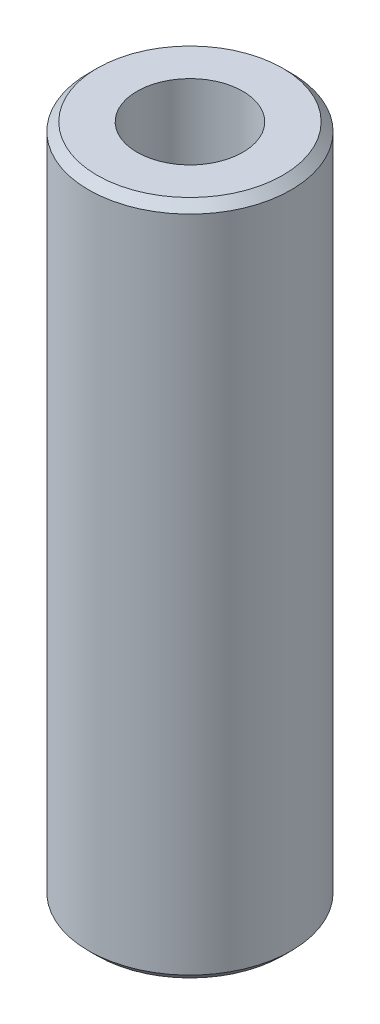
ISO-10303-21;
HEADER;
FILE_DESCRIPTION(('STEP AP214'),'2;1');
FILE_NAME('part.step','',(''),(''),'','','');
FILE_SCHEMA(('AUTOMOTIVE_DESIGN { 1 0 10303 214 1 1 1 1 }'));
ENDSEC;
DATA;
#1=APPLICATION_CONTEXT('core data for automotive mechanical design processes');
#2=APPLICATION_PROTOCOL_DEFINITION('international standard','automotive_design',2000,#1);
#3=PRODUCT_CONTEXT('',#1,'mechanical');
#4=PRODUCT('Part','Part','',(#3));
#5=PRODUCT_RELATED_PRODUCT_CATEGORY('part','',(#4));
#6=PRODUCT_DEFINITION_FORMATION('','',#4);
#7=PRODUCT_DEFINITION_CONTEXT('part definition',#1,'design');
#8=PRODUCT_DEFINITION('design','',#6,#7);
#9=PRODUCT_DEFINITION_SHAPE('','',#8);
#10=(LENGTH_UNIT() NAMED_UNIT(*) SI_UNIT(.MILLI.,.METRE.));
#11=(NAMED_UNIT(*) PLANE_ANGLE_UNIT() SI_UNIT($,.RADIAN.));
#12=(NAMED_UNIT(*) SI_UNIT($,.STERADIAN.) SOLID_ANGLE_UNIT());
#13=UNCERTAINTY_MEASURE_WITH_UNIT(LENGTH_MEASURE(1.E-05),#10,'distance_accuracy_value','');
#14=(GEOMETRIC_REPRESENTATION_CONTEXT(3) GLOBAL_UNCERTAINTY_ASSIGNED_CONTEXT((#13)) GLOBAL_UNIT_ASSIGNED_CONTEXT((#10,
#11,#12)) REPRESENTATION_CONTEXT('',''));
#15=CARTESIAN_POINT('',(0.,0.,0.));
#16=DIRECTION('',(0.,0.,1.));
#17=DIRECTION('',(1.,0.,0.));
#18=AXIS2_PLACEMENT_3D('',#15,#16,#17);
#19=CARTESIAN_POINT('',(0.,15.89999995,0.));
#20=DIRECTION('',(0.,-1.,0.));
#21=DIRECTION('',(0.,0.,-1.));
#22=AXIS2_PLACEMENT_3D('',#19,#20,#21);
#23=CYLINDRICAL_SURFACE('',#22,4.7625);
#24=CARTESIAN_POINT('',(0.,-15.50312495,0.));
#25=DIRECTION('',(0.,1.,0.));
#26=DIRECTION('',(0.,0.,1.));
#27=AXIS2_PLACEMENT_3D('',#24,#25,#26);
#28=CIRCLE('',#27,4.7625);
#29=CARTESIAN_POINT('',(0.,-15.50312495,4.7625));
#30=VERTEX_POINT('',#29);
#31=EDGE_CURVE('E45',#30,#30,#28,.T.);
#32=ORIENTED_EDGE('',*,*,#31,.T.);
#33=EDGE_LOOP('',(#32));
#34=FACE_BOUND('',#33,.T.);
#35=CARTESIAN_POINT('',(0.,15.50312495,0.));
#36=DIRECTION('',(0.,1.,0.));
#37=DIRECTION('',(0.,0.,1.));
#38=AXIS2_PLACEMENT_3D('',#35,#36,#37);
#39=CIRCLE('',#38,4.7625);
#40=CARTESIAN_POINT('',(0.,15.50312495,4.7625));
#41=VERTEX_POINT('',#40);
#42=EDGE_CURVE('E49',#41,#41,#39,.F.);
#43=ORIENTED_EDGE('',*,*,#42,.T.);
#44=EDGE_LOOP('',(#43));
#45=FACE_BOUND('',#44,.T.);
#46=ADVANCED_FACE('F33',(#34,#45),#23,.T.);
#47=CARTESIAN_POINT('',(0.,15.89999995,0.));
#48=DIRECTION('',(0.,1.,0.));
#49=DIRECTION('',(0.,0.,1.));
#50=AXIS2_PLACEMENT_3D('',#47,#48,#49);
#51=PLANE('',#50);
#52=CARTESIAN_POINT('',(0.,15.89999995,0.));
#53=DIRECTION('',(0.,1.,0.));
#54=DIRECTION('',(0.,0.,1.));
#55=AXIS2_PLACEMENT_3D('',#52,#53,#54);
#56=CIRCLE('',#55,2.4892);
#57=CARTESIAN_POINT('',(0.,15.89999995,2.4892));
#58=VERTEX_POINT('',#57);
#59=EDGE_CURVE('E57',#58,#58,#56,.T.);
#60=ORIENTED_EDGE('',*,*,#59,.F.);
#61=EDGE_LOOP('',(#60));
#62=FACE_BOUND('',#61,.T.);
#63=CARTESIAN_POINT('',(0.,15.89999995,0.));
#64=DIRECTION('',(0.,1.,0.));
#65=DIRECTION('',(0.,0.,1.));
#66=AXIS2_PLACEMENT_3D('',#63,#64,#65);
#67=CIRCLE('',#66,4.365625);
#68=CARTESIAN_POINT('',(0.,15.89999995,4.365625));
#69=VERTEX_POINT('',#68);
#70=EDGE_CURVE('E10',#69,#69,#67,.T.);
#71=ORIENTED_EDGE('',*,*,#70,.T.);
#72=EDGE_LOOP('',(#71));
#73=FACE_BOUND('',#72,.T.);
#74=ADVANCED_FACE('F63',(#62,#73),#51,.T.);
#75=CARTESIAN_POINT('',(0.,-15.89999995,0.));
#76=DIRECTION('',(0.,1.,0.));
#77=DIRECTION('',(0.,0.,1.));
#78=AXIS2_PLACEMENT_3D('',#75,#76,#77);
#79=PLANE('',#78);
#80=CARTESIAN_POINT('',(0.,-15.89999995,0.));
#81=DIRECTION('',(0.,1.,0.));
#82=DIRECTION('',(0.,0.,1.));
#83=AXIS2_PLACEMENT_3D('',#80,#81,#82);
#84=CIRCLE('',#83,2.4892);
#85=CARTESIAN_POINT('',(0.,-15.89999995,2.4892));
#86=VERTEX_POINT('',#85);
#87=EDGE_CURVE('E54',#86,#86,#84,.T.);
#88=ORIENTED_EDGE('',*,*,#87,.T.);
#89=EDGE_LOOP('',(#88));
#90=FACE_BOUND('',#89,.T.);
#91=CARTESIAN_POINT('',(0.,-15.89999995,0.));
#92=DIRECTION('',(0.,1.,0.));
#93=DIRECTION('',(0.,0.,1.));
#94=AXIS2_PLACEMENT_3D('',#91,#92,#93);
#95=CIRCLE('',#94,4.365625);
#96=CARTESIAN_POINT('',(0.,-15.89999995,4.365625));
#97=VERTEX_POINT('',#96);
#98=EDGE_CURVE('E41',#97,#97,#95,.F.);
#99=ORIENTED_EDGE('',*,*,#98,.T.);
#100=EDGE_LOOP('',(#99));
#101=FACE_BOUND('',#100,.T.);
#102=ADVANCED_FACE('F65',(#90,#101),#79,.F.);
#103=CARTESIAN_POINT('',(0.,-15.50312495,0.));
#104=DIRECTION('',(0.,1.,0.));
#105=DIRECTION('',(0.,0.,1.));
#106=AXIS2_PLACEMENT_3D('',#103,#104,#105);
#107=CONICAL_SURFACE('',#106,4.7625,0.785398163397441);
#108=ORIENTED_EDGE('',*,*,#98,.F.);
#109=EDGE_LOOP('',(#108));
#110=FACE_BOUND('',#109,.T.);
#111=ORIENTED_EDGE('',*,*,#31,.F.);
#112=EDGE_LOOP('',(#111));
#113=FACE_BOUND('',#112,.T.);
#114=ADVANCED_FACE('F71',(#110,#113),#107,.T.);
#115=CARTESIAN_POINT('',(0.,15.89999995,0.));
#116=DIRECTION('',(0.,-1.,0.));
#117=DIRECTION('',(0.,0.,-1.));
#118=AXIS2_PLACEMENT_3D('',#115,#116,#117);
#119=CONICAL_SURFACE('',#118,4.365625,0.785398163397441);
#120=ORIENTED_EDGE('',*,*,#42,.F.);
#121=EDGE_LOOP('',(#120));
#122=FACE_BOUND('',#121,.T.);
#123=ORIENTED_EDGE('',*,*,#70,.F.);
#124=EDGE_LOOP('',(#123));
#125=FACE_BOUND('',#124,.T.);
#126=ADVANCED_FACE('F36',(#122,#125),#119,.T.);
#127=CARTESIAN_POINT('',(0.,-15.89999995,0.));
#128=DIRECTION('',(0.,1.,0.));
#129=DIRECTION('',(0.,0.,1.));
#130=AXIS2_PLACEMENT_3D('',#127,#128,#129);
#131=CYLINDRICAL_SURFACE('',#130,2.4892);
#132=ORIENTED_EDGE('',*,*,#87,.F.);
#133=EDGE_LOOP('',(#132));
#134=FACE_BOUND('',#133,.T.);
#135=ORIENTED_EDGE('',*,*,#59,.T.);
#136=EDGE_LOOP('',(#135));
#137=FACE_BOUND('',#136,.T.);
#138=ADVANCED_FACE('F61',(#134,#137),#131,.F.);
#139=CLOSED_SHELL('',(#46,#74,#102,#114,#126,#138));
#140=MANIFOLD_SOLID_BREP('B2',#139);
#141=ADVANCED_BREP_SHAPE_REPRESENTATION('',(#18,#140),#14);
#142=SHAPE_DEFINITION_REPRESENTATION(#9,#141);
ENDSEC;
END-ISO-10303-21;
